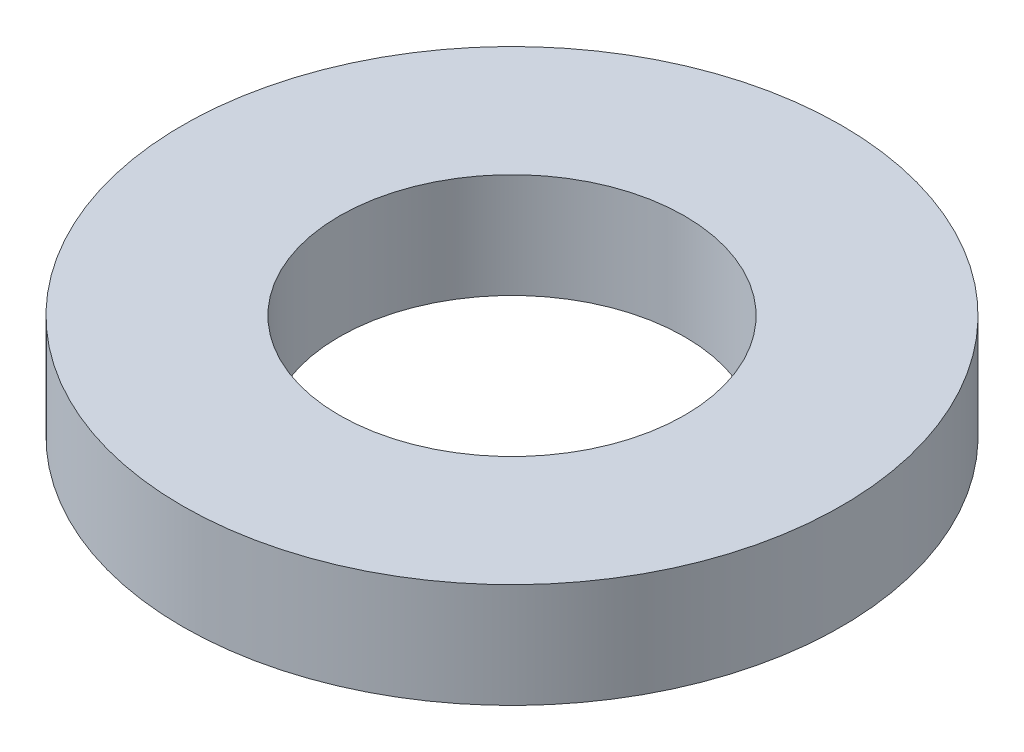
ISO-10303-21;
HEADER;
FILE_DESCRIPTION(('STEP AP214'),'2;1');
FILE_NAME('part.step','',(''),(''),'','','');
FILE_SCHEMA(('AUTOMOTIVE_DESIGN { 1 0 10303 214 1 1 1 1 }'));
ENDSEC;
DATA;
#1=APPLICATION_CONTEXT('core data for automotive mechanical design processes');
#2=APPLICATION_PROTOCOL_DEFINITION('international standard','automotive_design',2000,#1);
#3=PRODUCT_CONTEXT('',#1,'mechanical');
#4=PRODUCT('Part','Part','',(#3));
#5=PRODUCT_RELATED_PRODUCT_CATEGORY('part','',(#4));
#6=PRODUCT_DEFINITION_FORMATION('','',#4);
#7=PRODUCT_DEFINITION_CONTEXT('part definition',#1,'design');
#8=PRODUCT_DEFINITION('design','',#6,#7);
#9=PRODUCT_DEFINITION_SHAPE('','',#8);
#10=(LENGTH_UNIT() NAMED_UNIT(*) SI_UNIT(.MILLI.,.METRE.));
#11=(NAMED_UNIT(*) PLANE_ANGLE_UNIT() SI_UNIT($,.RADIAN.));
#12=(NAMED_UNIT(*) SI_UNIT($,.STERADIAN.) SOLID_ANGLE_UNIT());
#13=UNCERTAINTY_MEASURE_WITH_UNIT(LENGTH_MEASURE(1.E-05),#10,'distance_accuracy_value','');
#14=(GEOMETRIC_REPRESENTATION_CONTEXT(3) GLOBAL_UNCERTAINTY_ASSIGNED_CONTEXT((#13)) GLOBAL_UNIT_ASSIGNED_CONTEXT((#10,
#11,#12)) REPRESENTATION_CONTEXT('',''));
#15=CARTESIAN_POINT('',(0.,0.,0.));
#16=DIRECTION('',(0.,0.,1.));
#17=DIRECTION('',(1.,0.,0.));
#18=AXIS2_PLACEMENT_3D('',#15,#16,#17);
#19=CARTESIAN_POINT('',(0.,10.,0.));
#20=DIRECTION('',(0.,1.,0.));
#21=DIRECTION('',(0.,0.,1.));
#22=AXIS2_PLACEMENT_3D('',#19,#20,#21);
#23=PLANE('',#22);
#24=CARTESIAN_POINT('',(0.,10.,0.));
#25=DIRECTION('',(0.,1.,0.));
#26=DIRECTION('',(0.,0.,1.));
#27=AXIS2_PLACEMENT_3D('',#24,#25,#26);
#28=CIRCLE('',#27,31.5);
#29=CARTESIAN_POINT('',(0.,10.,31.5));
#30=VERTEX_POINT('',#29);
#31=EDGE_CURVE('E10',#30,#30,#28,.T.);
#32=ORIENTED_EDGE('',*,*,#31,.T.);
#33=EDGE_LOOP('',(#32));
#34=FACE_BOUND('',#33,.T.);
#35=CARTESIAN_POINT('',(0.,10.,0.));
#36=DIRECTION('',(0.,1.,0.));
#37=DIRECTION('',(0.,0.,1.));
#38=AXIS2_PLACEMENT_3D('',#35,#36,#37);
#39=CIRCLE('',#38,16.5);
#40=CARTESIAN_POINT('',(0.,10.,16.5));
#41=VERTEX_POINT('',#40);
#42=EDGE_CURVE('E50',#41,#41,#39,.T.);
#43=ORIENTED_EDGE('',*,*,#42,.F.);
#44=EDGE_LOOP('',(#43));
#45=FACE_BOUND('',#44,.T.);
#46=ADVANCED_FACE('F36',(#34,#45),#23,.T.);
#47=CARTESIAN_POINT('',(0.,0.,0.));
#48=DIRECTION('',(0.,1.,0.));
#49=DIRECTION('',(0.,0.,1.));
#50=AXIS2_PLACEMENT_3D('',#47,#48,#49);
#51=PLANE('',#50);
#52=CARTESIAN_POINT('',(0.,0.,0.));
#53=DIRECTION('',(0.,1.,0.));
#54=DIRECTION('',(0.,0.,1.));
#55=AXIS2_PLACEMENT_3D('',#52,#53,#54);
#56=CIRCLE('',#55,31.5);
#57=CARTESIAN_POINT('',(0.,0.,31.5));
#58=VERTEX_POINT('',#57);
#59=EDGE_CURVE('E40',#58,#58,#56,.T.);
#60=ORIENTED_EDGE('',*,*,#59,.F.);
#61=EDGE_LOOP('',(#60));
#62=FACE_BOUND('',#61,.T.);
#63=CARTESIAN_POINT('',(0.,0.,0.));
#64=DIRECTION('',(0.,1.,0.));
#65=DIRECTION('',(0.,0.,1.));
#66=AXIS2_PLACEMENT_3D('',#63,#64,#65);
#67=CIRCLE('',#66,16.5);
#68=CARTESIAN_POINT('',(0.,0.,16.5));
#69=VERTEX_POINT('',#68);
#70=EDGE_CURVE('E52',#69,#69,#67,.T.);
#71=ORIENTED_EDGE('',*,*,#70,.T.);
#72=EDGE_LOOP('',(#71));
#73=FACE_BOUND('',#72,.T.);
#74=ADVANCED_FACE('F65',(#62,#73),#51,.F.);
#75=CARTESIAN_POINT('',(0.,10.,0.));
#76=DIRECTION('',(0.,-1.,0.));
#77=DIRECTION('',(0.,0.,-1.));
#78=AXIS2_PLACEMENT_3D('',#75,#76,#77);
#79=CYLINDRICAL_SURFACE('',#78,31.5);
#80=ORIENTED_EDGE('',*,*,#31,.F.);
#81=EDGE_LOOP('',(#80));
#82=FACE_BOUND('',#81,.T.);
#83=ORIENTED_EDGE('',*,*,#59,.T.);
#84=EDGE_LOOP('',(#83));
#85=FACE_BOUND('',#84,.T.);
#86=ADVANCED_FACE('F38',(#82,#85),#79,.T.);
#87=CARTESIAN_POINT('',(0.,10.,0.));
#88=DIRECTION('',(0.,-1.,0.));
#89=DIRECTION('',(0.,0.,-1.));
#90=AXIS2_PLACEMENT_3D('',#87,#88,#89);
#91=CYLINDRICAL_SURFACE('',#90,16.5);
#92=ORIENTED_EDGE('',*,*,#42,.T.);
#93=EDGE_LOOP('',(#92));
#94=FACE_BOUND('',#93,.T.);
#95=ORIENTED_EDGE('',*,*,#70,.F.);
#96=EDGE_LOOP('',(#95));
#97=FACE_BOUND('',#96,.T.);
#98=ADVANCED_FACE('F61',(#94,#97),#91,.F.);
#99=CLOSED_SHELL('',(#46,#74,#86,#98));
#100=MANIFOLD_SOLID_BREP('B2',#99);
#101=ADVANCED_BREP_SHAPE_REPRESENTATION('',(#18,#100),#14);
#102=SHAPE_DEFINITION_REPRESENTATION(#9,#101);
ENDSEC;
END-ISO-10303-21;
